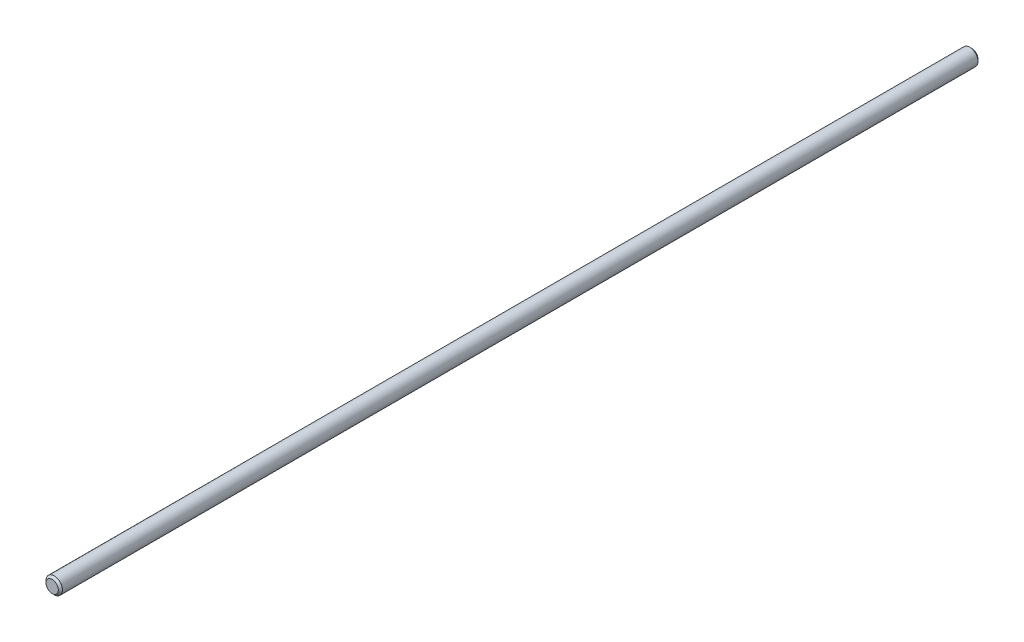
ISO-10303-21;
HEADER;
FILE_DESCRIPTION(('STEP AP214'),'2;1');
FILE_NAME('part.step','',(''),(''),'','','');
FILE_SCHEMA(('AUTOMOTIVE_DESIGN { 1 0 10303 214 1 1 1 1 }'));
ENDSEC;
DATA;
#1=APPLICATION_CONTEXT('core data for automotive mechanical design processes');
#2=APPLICATION_PROTOCOL_DEFINITION('international standard','automotive_design',2000,#1);
#3=PRODUCT_CONTEXT('',#1,'mechanical');
#4=PRODUCT('Part','Part','',(#3));
#5=PRODUCT_RELATED_PRODUCT_CATEGORY('part','',(#4));
#6=PRODUCT_DEFINITION_FORMATION('','',#4);
#7=PRODUCT_DEFINITION_CONTEXT('part definition',#1,'design');
#8=PRODUCT_DEFINITION('design','',#6,#7);
#9=PRODUCT_DEFINITION_SHAPE('','',#8);
#10=(LENGTH_UNIT() NAMED_UNIT(*) SI_UNIT(.MILLI.,.METRE.));
#11=(NAMED_UNIT(*) PLANE_ANGLE_UNIT() SI_UNIT($,.RADIAN.));
#12=(NAMED_UNIT(*) SI_UNIT($,.STERADIAN.) SOLID_ANGLE_UNIT());
#13=UNCERTAINTY_MEASURE_WITH_UNIT(LENGTH_MEASURE(1.E-05),#10,'distance_accuracy_value','');
#14=(GEOMETRIC_REPRESENTATION_CONTEXT(3) GLOBAL_UNCERTAINTY_ASSIGNED_CONTEXT((#13)) GLOBAL_UNIT_ASSIGNED_CONTEXT((#10,
#11,#12)) REPRESENTATION_CONTEXT('',''));
#15=CARTESIAN_POINT('',(0.,0.,0.));
#16=DIRECTION('',(0.,0.,1.));
#17=DIRECTION('',(1.,0.,0.));
#18=AXIS2_PLACEMENT_3D('',#15,#16,#17);
#19=CARTESIAN_POINT('',(0.,0.,448.));
#20=DIRECTION('',(0.,0.,-1.));
#21=DIRECTION('',(-1.,0.,0.));
#22=AXIS2_PLACEMENT_3D('',#19,#20,#21);
#23=CYLINDRICAL_SURFACE('',#22,4.);
#24=CARTESIAN_POINT('',(0.,0.,447.));
#25=DIRECTION('',(0.,0.,1.));
#26=DIRECTION('',(1.,0.,0.));
#27=AXIS2_PLACEMENT_3D('',#24,#25,#26);
#28=CIRCLE('',#27,4.);
#29=CARTESIAN_POINT('',(4.,0.,447.));
#30=VERTEX_POINT('',#29);
#31=EDGE_CURVE('E38',#30,#30,#28,.F.);
#32=ORIENTED_EDGE('',*,*,#31,.T.);
#33=EDGE_LOOP('',(#32));
#34=FACE_BOUND('',#33,.T.);
#35=CARTESIAN_POINT('',(0.,0.,1.));
#36=DIRECTION('',(0.,0.,1.));
#37=DIRECTION('',(1.,0.,0.));
#38=AXIS2_PLACEMENT_3D('',#35,#36,#37);
#39=CIRCLE('',#38,4.);
#40=CARTESIAN_POINT('',(4.,0.,1.));
#41=VERTEX_POINT('',#40);
#42=EDGE_CURVE('E42',#41,#41,#39,.T.);
#43=ORIENTED_EDGE('',*,*,#42,.T.);
#44=EDGE_LOOP('',(#43));
#45=FACE_BOUND('',#44,.T.);
#46=ADVANCED_FACE('F31',(#34,#45),#23,.T.);
#47=CARTESIAN_POINT('',(0.,0.,448.));
#48=DIRECTION('',(0.,0.,1.));
#49=DIRECTION('',(1.,0.,0.));
#50=AXIS2_PLACEMENT_3D('',#47,#48,#49);
#51=PLANE('',#50);
#52=CARTESIAN_POINT('',(0.,0.,448.));
#53=DIRECTION('',(0.,0.,1.));
#54=DIRECTION('',(1.,0.,0.));
#55=AXIS2_PLACEMENT_3D('',#52,#53,#54);
#56=CIRCLE('',#55,2.99999999999995);
#57=CARTESIAN_POINT('',(2.99999999999995,0.,448.));
#58=VERTEX_POINT('',#57);
#59=EDGE_CURVE('E46',#58,#58,#56,.T.);
#60=ORIENTED_EDGE('',*,*,#59,.T.);
#61=EDGE_LOOP('',(#60));
#62=FACE_BOUND('',#61,.T.);
#63=ADVANCED_FACE('F52',(#62),#51,.T.);
#64=CARTESIAN_POINT('',(0.,0.,0.));
#65=DIRECTION('',(0.,0.,1.));
#66=DIRECTION('',(1.,0.,0.));
#67=AXIS2_PLACEMENT_3D('',#64,#65,#66);
#68=PLANE('',#67);
#69=CARTESIAN_POINT('',(0.,0.,0.));
#70=DIRECTION('',(0.,0.,1.));
#71=DIRECTION('',(1.,0.,0.));
#72=AXIS2_PLACEMENT_3D('',#69,#70,#71);
#73=CIRCLE('',#72,3.00000000000006);
#74=CARTESIAN_POINT('',(3.00000000000006,0.,0.));
#75=VERTEX_POINT('',#74);
#76=EDGE_CURVE('E10',#75,#75,#73,.F.);
#77=ORIENTED_EDGE('',*,*,#76,.T.);
#78=EDGE_LOOP('',(#77));
#79=FACE_BOUND('',#78,.T.);
#80=ADVANCED_FACE('F56',(#79),#68,.F.);
#81=CARTESIAN_POINT('',(0.,0.,448.));
#82=DIRECTION('',(0.,0.,-1.));
#83=DIRECTION('',(-1.,0.,0.));
#84=AXIS2_PLACEMENT_3D('',#81,#82,#83);
#85=CONICAL_SURFACE('',#84,2.99999999999995,0.785398163397447);
#86=ORIENTED_EDGE('',*,*,#31,.F.);
#87=EDGE_LOOP('',(#86));
#88=FACE_BOUND('',#87,.T.);
#89=ORIENTED_EDGE('',*,*,#59,.F.);
#90=EDGE_LOOP('',(#89));
#91=FACE_BOUND('',#90,.T.);
#92=ADVANCED_FACE('F54',(#88,#91),#85,.T.);
#93=CARTESIAN_POINT('',(0.,0.,1.));
#94=DIRECTION('',(0.,0.,1.));
#95=DIRECTION('',(1.,0.,0.));
#96=AXIS2_PLACEMENT_3D('',#93,#94,#95);
#97=CONICAL_SURFACE('',#96,4.,0.785398163397419);
#98=ORIENTED_EDGE('',*,*,#76,.F.);
#99=EDGE_LOOP('',(#98));
#100=FACE_BOUND('',#99,.T.);
#101=ORIENTED_EDGE('',*,*,#42,.F.);
#102=EDGE_LOOP('',(#101));
#103=FACE_BOUND('',#102,.T.);
#104=ADVANCED_FACE('F33',(#100,#103),#97,.T.);
#105=CLOSED_SHELL('',(#46,#63,#80,#92,#104));
#106=MANIFOLD_SOLID_BREP('B2',#105);
#107=ADVANCED_BREP_SHAPE_REPRESENTATION('',(#18,#106),#14);
#108=SHAPE_DEFINITION_REPRESENTATION(#9,#107);
ENDSEC;
END-ISO-10303-21;
